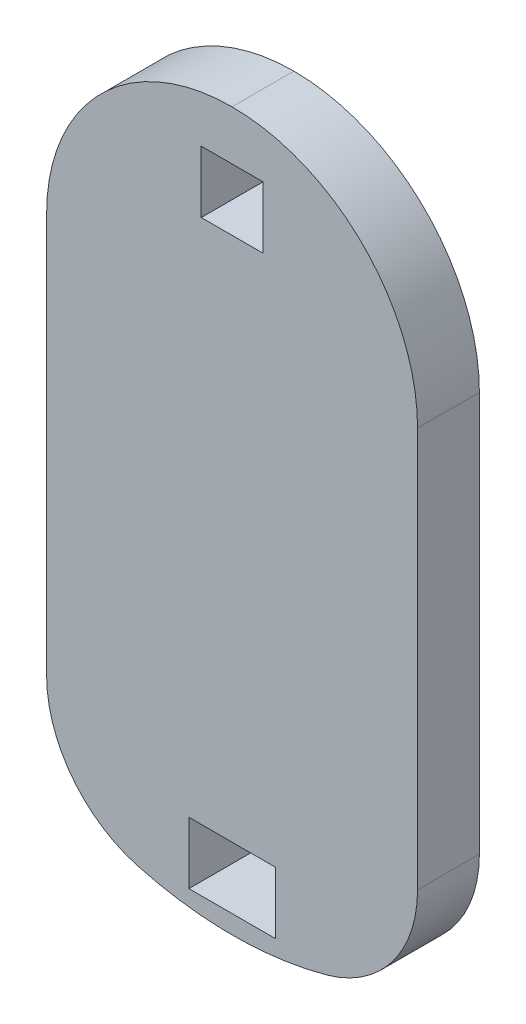
ISO-10303-21;
HEADER;
FILE_DESCRIPTION(('STEP AP214'),'2;1');
FILE_NAME('part.step','',(''),(''),'','','');
FILE_SCHEMA(('AUTOMOTIVE_DESIGN { 1 0 10303 214 1 1 1 1 }'));
ENDSEC;
DATA;
#1=APPLICATION_CONTEXT('core data for automotive mechanical design processes');
#2=APPLICATION_PROTOCOL_DEFINITION('international standard','automotive_design',2000,#1);
#3=PRODUCT_CONTEXT('',#1,'mechanical');
#4=PRODUCT('Part','Part','',(#3));
#5=PRODUCT_RELATED_PRODUCT_CATEGORY('part','',(#4));
#6=PRODUCT_DEFINITION_FORMATION('','',#4);
#7=PRODUCT_DEFINITION_CONTEXT('part definition',#1,'design');
#8=PRODUCT_DEFINITION('design','',#6,#7);
#9=PRODUCT_DEFINITION_SHAPE('','',#8);
#10=(LENGTH_UNIT() NAMED_UNIT(*) SI_UNIT(.MILLI.,.METRE.));
#11=(NAMED_UNIT(*) PLANE_ANGLE_UNIT() SI_UNIT($,.RADIAN.));
#12=(NAMED_UNIT(*) SI_UNIT($,.STERADIAN.) SOLID_ANGLE_UNIT());
#13=UNCERTAINTY_MEASURE_WITH_UNIT(LENGTH_MEASURE(1.E-05),#10,'distance_accuracy_value','');
#14=(GEOMETRIC_REPRESENTATION_CONTEXT(3) GLOBAL_UNCERTAINTY_ASSIGNED_CONTEXT((#13)) GLOBAL_UNIT_ASSIGNED_CONTEXT((#10,
#11,#12)) REPRESENTATION_CONTEXT('',''));
#15=CARTESIAN_POINT('',(0.,0.,0.));
#16=DIRECTION('',(0.,0.,1.));
#17=DIRECTION('',(1.,0.,0.));
#18=AXIS2_PLACEMENT_3D('',#15,#16,#17);
#19=CARTESIAN_POINT('',(0.,0.,5.));
#20=DIRECTION('',(0.,0.,-1.));
#21=DIRECTION('',(-1.,0.,0.));
#22=AXIS2_PLACEMENT_3D('',#19,#20,#21);
#23=CYLINDRICAL_SURFACE('',#22,29.);
#24=CARTESIAN_POINT('',(0.,0.,5.));
#25=DIRECTION('',(0.,0.,1.));
#26=DIRECTION('',(1.,0.,0.));
#27=AXIS2_PLACEMENT_3D('',#24,#25,#26);
#28=CIRCLE('',#27,29.);
#29=CARTESIAN_POINT('',(-7.63882553025275,-27.9758528827694,5.));
#30=VERTEX_POINT('',#29);
#31=CARTESIAN_POINT('',(7.62433236448409,-27.979806217983,5.));
#32=VERTEX_POINT('',#31);
#33=EDGE_CURVE('E199',#30,#32,#28,.T.);
#34=ORIENTED_EDGE('',*,*,#33,.F.);
#35=DIRECTION('',(0.,0.,-1.));
#36=VECTOR('',#35,1.);
#37=CARTESIAN_POINT('',(-7.63882553025275,-27.9758528827694,5.));
#38=LINE('',#37,#36);
#39=CARTESIAN_POINT('',(-7.63882553025275,-27.9758528827694,0.));
#40=VERTEX_POINT('',#39);
#41=EDGE_CURVE('E235',#30,#40,#38,.T.);
#42=ORIENTED_EDGE('',*,*,#41,.T.);
#43=CARTESIAN_POINT('',(0.,0.,0.));
#44=DIRECTION('',(0.,0.,1.));
#45=DIRECTION('',(1.,0.,0.));
#46=AXIS2_PLACEMENT_3D('',#43,#44,#45);
#47=CIRCLE('',#46,29.);
#48=CARTESIAN_POINT('',(7.62433236448409,-27.979806217983,0.));
#49=VERTEX_POINT('',#48);
#50=EDGE_CURVE('E195',#40,#49,#47,.T.);
#51=ORIENTED_EDGE('',*,*,#50,.T.);
#52=DIRECTION('',(0.,0.,-1.));
#53=VECTOR('',#52,1.);
#54=CARTESIAN_POINT('',(7.62433236448409,-27.979806217983,5.));
#55=LINE('',#54,#53);
#56=EDGE_CURVE('E232',#49,#32,#55,.F.);
#57=ORIENTED_EDGE('',*,*,#56,.T.);
#58=EDGE_LOOP('',(#34,#42,#51,#57));
#59=FACE_BOUND('',#58,.T.);
#60=ADVANCED_FACE('F34',(#59),#23,.T.);
#61=CARTESIAN_POINT('',(0.,0.,5.));
#62=DIRECTION('',(0.,0.,1.));
#63=DIRECTION('',(1.,0.,0.));
#64=AXIS2_PLACEMENT_3D('',#61,#62,#63);
#65=PLANE('',#64);
#66=DIRECTION('',(0.,-1.,0.));
#67=VECTOR('',#66,1.);
#68=CARTESIAN_POINT('',(-2.5,24.9999983324085,5.));
#69=LINE('',#68,#67);
#70=CARTESIAN_POINT('',(-2.5,24.9999983324085,5.));
#71=VERTEX_POINT('',#70);
#72=CARTESIAN_POINT('',(-2.5,19.9999983324085,5.));
#73=VERTEX_POINT('',#72);
#74=EDGE_CURVE('E49',#71,#73,#69,.T.);
#75=ORIENTED_EDGE('',*,*,#74,.F.);
#76=DIRECTION('',(-1.,0.,0.));
#77=VECTOR('',#76,1.);
#78=CARTESIAN_POINT('',(-2.5,24.9999983324085,5.));
#79=LINE('',#78,#77);
#80=CARTESIAN_POINT('',(2.5,24.9999983324085,5.));
#81=VERTEX_POINT('',#80);
#82=EDGE_CURVE('E165',#81,#71,#79,.T.);
#83=ORIENTED_EDGE('',*,*,#82,.F.);
#84=DIRECTION('',(0.,1.,0.));
#85=VECTOR('',#84,1.);
#86=CARTESIAN_POINT('',(2.5,24.9999983324085,5.));
#87=LINE('',#86,#85);
#88=CARTESIAN_POINT('',(2.5,19.9999983324085,5.));
#89=VERTEX_POINT('',#88);
#90=EDGE_CURVE('E148',#89,#81,#87,.T.);
#91=ORIENTED_EDGE('',*,*,#90,.F.);
#92=DIRECTION('',(1.,0.,0.));
#93=VECTOR('',#92,1.);
#94=CARTESIAN_POINT('',(-2.5,19.9999983324085,5.));
#95=LINE('',#94,#93);
#96=EDGE_CURVE('E158',#73,#89,#95,.T.);
#97=ORIENTED_EDGE('',*,*,#96,.F.);
#98=EDGE_LOOP('',(#75,#83,#91,#97));
#99=FACE_BOUND('',#98,.T.);
#100=DIRECTION('',(0.,-1.,0.));
#101=VECTOR('',#100,1.);
#102=CARTESIAN_POINT('',(-3.5,-22.5000016675915,5.));
#103=LINE('',#102,#101);
#104=CARTESIAN_POINT('',(-3.5,-22.5000016675915,5.));
#105=VERTEX_POINT('',#104);
#106=CARTESIAN_POINT('',(-3.5,-27.5000016675915,5.));
#107=VERTEX_POINT('',#106);
#108=EDGE_CURVE('E57',#105,#107,#103,.T.);
#109=ORIENTED_EDGE('',*,*,#108,.F.);
#110=DIRECTION('',(-1.,0.,0.));
#111=VECTOR('',#110,1.);
#112=CARTESIAN_POINT('',(-3.5,-22.5000016675915,5.));
#113=LINE('',#112,#111);
#114=CARTESIAN_POINT('',(3.5,-22.5000016675915,5.));
#115=VERTEX_POINT('',#114);
#116=EDGE_CURVE('E182',#115,#105,#113,.T.);
#117=ORIENTED_EDGE('',*,*,#116,.F.);
#118=DIRECTION('',(0.,1.,0.));
#119=VECTOR('',#118,1.);
#120=CARTESIAN_POINT('',(3.5,-22.5000016675915,5.));
#121=LINE('',#120,#119);
#122=CARTESIAN_POINT('',(3.5,-27.5000016675915,5.));
#123=VERTEX_POINT('',#122);
#124=EDGE_CURVE('E179',#123,#115,#121,.T.);
#125=ORIENTED_EDGE('',*,*,#124,.F.);
#126=DIRECTION('',(1.,0.,0.));
#127=VECTOR('',#126,1.);
#128=CARTESIAN_POINT('',(-3.5,-27.5000016675915,5.));
#129=LINE('',#128,#127);
#130=EDGE_CURVE('E176',#107,#123,#129,.T.);
#131=ORIENTED_EDGE('',*,*,#130,.F.);
#132=EDGE_LOOP('',(#109,#117,#125,#131));
#133=FACE_BOUND('',#132,.T.);
#134=DIRECTION('',(0.,1.,0.));
#135=VECTOR('',#134,1.);
#136=CARTESIAN_POINT('',(-15.0047477612001,24.8164772806851,5.));
#137=LINE('',#136,#135);
#138=CARTESIAN_POINT('',(-15.0047477612001,-18.3290070611248,5.));
#139=VERTEX_POINT('',#138);
#140=CARTESIAN_POINT('',(-15.0047477612001,13.9999991949558,5.));
#141=VERTEX_POINT('',#140);
#142=EDGE_CURVE('E193',#139,#141,#137,.T.);
#143=ORIENTED_EDGE('',*,*,#142,.F.);
#144=CARTESIAN_POINT('',(-5.00474776120008,-18.3290070611248,5.));
#145=DIRECTION('',(0.,0.,1.));
#146=DIRECTION('',(1.,0.,0.));
#147=AXIS2_PLACEMENT_3D('',#144,#145,#146);
#148=CIRCLE('',#147,10.);
#149=EDGE_CURVE('E230',#139,#30,#148,.T.);
#150=ORIENTED_EDGE('',*,*,#149,.T.);
#151=ORIENTED_EDGE('',*,*,#33,.T.);
#152=CARTESIAN_POINT('',(4.99525223879992,-18.3315971772992,5.));
#153=DIRECTION('',(0.,0.,1.));
#154=DIRECTION('',(1.,0.,0.));
#155=AXIS2_PLACEMENT_3D('',#152,#153,#154);
#156=CIRCLE('',#155,10.);
#157=CARTESIAN_POINT('',(14.9952522387999,-18.3315971772992,5.));
#158=VERTEX_POINT('',#157);
#159=EDGE_CURVE('E228',#32,#158,#156,.T.);
#160=ORIENTED_EDGE('',*,*,#159,.T.);
#161=DIRECTION('',(0.,-1.,0.));
#162=VECTOR('',#161,1.);
#163=CARTESIAN_POINT('',(14.9952522387999,24.8222160633326,5.));
#164=LINE('',#163,#162);
#165=CARTESIAN_POINT('',(14.9952522387999,13.9999991949558,5.));
#166=VERTEX_POINT('',#165);
#167=EDGE_CURVE('E196',#166,#158,#164,.T.);
#168=ORIENTED_EDGE('',*,*,#167,.F.);
#169=CARTESIAN_POINT('',(-0.00474776120007632,13.9999991949558,5.));
#170=DIRECTION('',(0.,0.,1.));
#171=DIRECTION('',(1.,0.,0.));
#172=AXIS2_PLACEMENT_3D('',#169,#170,#171);
#173=CIRCLE('',#172,15.);
#174=CARTESIAN_POINT('',(-0.00983464820015809,28.9999983324085,5.));
#175=VERTEX_POINT('',#174);
#176=EDGE_CURVE('E209',#166,#175,#173,.T.);
#177=ORIENTED_EDGE('',*,*,#176,.T.);
#178=CARTESIAN_POINT('',(-0.00474776120007805,13.9999991949558,5.));
#179=DIRECTION('',(0.,0.,1.));
#180=DIRECTION('',(1.,0.,0.));
#181=AXIS2_PLACEMENT_3D('',#178,#179,#180);
#182=CIRCLE('',#181,15.);
#183=EDGE_CURVE('E211',#175,#141,#182,.T.);
#184=ORIENTED_EDGE('',*,*,#183,.T.);
#185=EDGE_LOOP('',(#143,#150,#151,#160,#168,#177,#184));
#186=FACE_BOUND('',#185,.T.);
#187=ADVANCED_FACE('F162',(#99,#133,#186),#65,.T.);
#188=CARTESIAN_POINT('',(0.,0.,0.));
#189=DIRECTION('',(0.,0.,1.));
#190=DIRECTION('',(1.,0.,0.));
#191=AXIS2_PLACEMENT_3D('',#188,#189,#190);
#192=PLANE('',#191);
#193=DIRECTION('',(-1.,0.,0.));
#194=VECTOR('',#193,1.);
#195=CARTESIAN_POINT('',(0.,24.9999983324085,0.));
#196=LINE('',#195,#194);
#197=CARTESIAN_POINT('',(2.5,24.9999983324085,0.));
#198=VERTEX_POINT('',#197);
#199=CARTESIAN_POINT('',(-2.5,24.9999983324085,0.));
#200=VERTEX_POINT('',#199);
#201=EDGE_CURVE('E42',#198,#200,#196,.T.);
#202=ORIENTED_EDGE('',*,*,#201,.T.);
#203=DIRECTION('',(0.,-1.,0.));
#204=VECTOR('',#203,1.);
#205=CARTESIAN_POINT('',(-2.5,0.,0.));
#206=LINE('',#205,#204);
#207=CARTESIAN_POINT('',(-2.5,19.9999983324085,0.));
#208=VERTEX_POINT('',#207);
#209=EDGE_CURVE('E11',#200,#208,#206,.T.);
#210=ORIENTED_EDGE('',*,*,#209,.T.);
#211=DIRECTION('',(1.,0.,0.));
#212=VECTOR('',#211,1.);
#213=CARTESIAN_POINT('',(0.,19.9999983324085,0.));
#214=LINE('',#213,#212);
#215=CARTESIAN_POINT('',(2.5,19.9999983324085,0.));
#216=VERTEX_POINT('',#215);
#217=EDGE_CURVE('E255',#208,#216,#214,.T.);
#218=ORIENTED_EDGE('',*,*,#217,.T.);
#219=DIRECTION('',(0.,1.,0.));
#220=VECTOR('',#219,1.);
#221=CARTESIAN_POINT('',(2.5,0.,0.));
#222=LINE('',#221,#220);
#223=EDGE_CURVE('E151',#216,#198,#222,.T.);
#224=ORIENTED_EDGE('',*,*,#223,.T.);
#225=EDGE_LOOP('',(#202,#210,#218,#224));
#226=FACE_BOUND('',#225,.T.);
#227=DIRECTION('',(-1.,0.,0.));
#228=VECTOR('',#227,1.);
#229=CARTESIAN_POINT('',(0.,-22.5000016675915,0.));
#230=LINE('',#229,#228);
#231=CARTESIAN_POINT('',(3.5,-22.5000016675915,0.));
#232=VERTEX_POINT('',#231);
#233=CARTESIAN_POINT('',(-3.5,-22.5000016675915,0.));
#234=VERTEX_POINT('',#233);
#235=EDGE_CURVE('E249',#232,#234,#230,.T.);
#236=ORIENTED_EDGE('',*,*,#235,.T.);
#237=DIRECTION('',(0.,-1.,0.));
#238=VECTOR('',#237,1.);
#239=CARTESIAN_POINT('',(-3.5,0.,0.));
#240=LINE('',#239,#238);
#241=CARTESIAN_POINT('',(-3.5,-27.5000016675915,0.));
#242=VERTEX_POINT('',#241);
#243=EDGE_CURVE('E252',#234,#242,#240,.T.);
#244=ORIENTED_EDGE('',*,*,#243,.T.);
#245=DIRECTION('',(1.,0.,0.));
#246=VECTOR('',#245,1.);
#247=CARTESIAN_POINT('',(0.,-27.5000016675915,0.));
#248=LINE('',#247,#246);
#249=CARTESIAN_POINT('',(3.5,-27.5000016675915,0.));
#250=VERTEX_POINT('',#249);
#251=EDGE_CURVE('E243',#242,#250,#248,.T.);
#252=ORIENTED_EDGE('',*,*,#251,.T.);
#253=DIRECTION('',(0.,1.,0.));
#254=VECTOR('',#253,1.);
#255=CARTESIAN_POINT('',(3.5,0.,0.));
#256=LINE('',#255,#254);
#257=EDGE_CURVE('E246',#250,#232,#256,.T.);
#258=ORIENTED_EDGE('',*,*,#257,.T.);
#259=EDGE_LOOP('',(#236,#244,#252,#258));
#260=FACE_BOUND('',#259,.T.);
#261=ORIENTED_EDGE('',*,*,#50,.F.);
#262=CARTESIAN_POINT('',(-5.00474776120008,-18.3290070611248,0.));
#263=DIRECTION('',(0.,0.,1.));
#264=DIRECTION('',(1.,0.,0.));
#265=AXIS2_PLACEMENT_3D('',#262,#263,#264);
#266=CIRCLE('',#265,10.);
#267=CARTESIAN_POINT('',(-15.0047477612001,-18.3290070611248,0.));
#268=VERTEX_POINT('',#267);
#269=EDGE_CURVE('E239',#40,#268,#266,.F.);
#270=ORIENTED_EDGE('',*,*,#269,.T.);
#271=DIRECTION('',(0.,1.,0.));
#272=VECTOR('',#271,1.);
#273=CARTESIAN_POINT('',(-15.0047477612001,0.,0.));
#274=LINE('',#273,#272);
#275=CARTESIAN_POINT('',(-15.0047477612001,13.9999991949558,0.));
#276=VERTEX_POINT('',#275);
#277=EDGE_CURVE('E207',#268,#276,#274,.T.);
#278=ORIENTED_EDGE('',*,*,#277,.T.);
#279=CARTESIAN_POINT('',(-0.00474776120007805,13.9999991949558,0.));
#280=DIRECTION('',(0.,0.,1.));
#281=DIRECTION('',(1.,0.,0.));
#282=AXIS2_PLACEMENT_3D('',#279,#280,#281);
#283=CIRCLE('',#282,15.);
#284=CARTESIAN_POINT('',(-0.00983464820015809,28.9999983324085,0.));
#285=VERTEX_POINT('',#284);
#286=EDGE_CURVE('E219',#276,#285,#283,.F.);
#287=ORIENTED_EDGE('',*,*,#286,.T.);
#288=CARTESIAN_POINT('',(-0.00474776120007632,13.9999991949558,0.));
#289=DIRECTION('',(0.,0.,1.));
#290=DIRECTION('',(1.,0.,0.));
#291=AXIS2_PLACEMENT_3D('',#288,#289,#290);
#292=CIRCLE('',#291,15.);
#293=CARTESIAN_POINT('',(14.9952522387999,13.9999991949558,0.));
#294=VERTEX_POINT('',#293);
#295=EDGE_CURVE('E217',#285,#294,#292,.F.);
#296=ORIENTED_EDGE('',*,*,#295,.T.);
#297=DIRECTION('',(0.,-1.,0.));
#298=VECTOR('',#297,1.);
#299=CARTESIAN_POINT('',(14.9952522387999,0.,0.));
#300=LINE('',#299,#298);
#301=CARTESIAN_POINT('',(14.9952522387999,-18.3315971772992,0.));
#302=VERTEX_POINT('',#301);
#303=EDGE_CURVE('E202',#294,#302,#300,.T.);
#304=ORIENTED_EDGE('',*,*,#303,.T.);
#305=CARTESIAN_POINT('',(4.99525223879992,-18.3315971772992,0.));
#306=DIRECTION('',(0.,0.,1.));
#307=DIRECTION('',(1.,0.,0.));
#308=AXIS2_PLACEMENT_3D('',#305,#306,#307);
#309=CIRCLE('',#308,10.);
#310=EDGE_CURVE('E237',#302,#49,#309,.F.);
#311=ORIENTED_EDGE('',*,*,#310,.T.);
#312=EDGE_LOOP('',(#261,#270,#278,#287,#296,#304,#311));
#313=FACE_BOUND('',#312,.T.);
#314=ADVANCED_FACE('F259',(#226,#260,#313),#192,.F.);
#315=CARTESIAN_POINT('',(14.9952522387999,24.8222160633326,-5.));
#316=DIRECTION('',(-1.,0.,0.));
#317=DIRECTION('',(0.,0.,1.));
#318=AXIS2_PLACEMENT_3D('',#315,#316,#317);
#319=PLANE('',#318);
#320=ORIENTED_EDGE('',*,*,#167,.T.);
#321=DIRECTION('',(0.,0.,-1.));
#322=VECTOR('',#321,1.);
#323=CARTESIAN_POINT('',(14.9952522387999,-18.3315971772992,-5.));
#324=LINE('',#323,#322);
#325=EDGE_CURVE('E241',#158,#302,#324,.T.);
#326=ORIENTED_EDGE('',*,*,#325,.T.);
#327=ORIENTED_EDGE('',*,*,#303,.F.);
#328=DIRECTION('',(0.,0.,-1.));
#329=VECTOR('',#328,1.);
#330=CARTESIAN_POINT('',(14.9952522387999,13.9999991949558,-5.));
#331=LINE('',#330,#329);
#332=EDGE_CURVE('E221',#294,#166,#331,.F.);
#333=ORIENTED_EDGE('',*,*,#332,.T.);
#334=EDGE_LOOP('',(#320,#326,#327,#333));
#335=FACE_BOUND('',#334,.T.);
#336=ADVANCED_FACE('F322',(#335),#319,.F.);
#337=CARTESIAN_POINT('',(-15.0047477612001,24.8164772806851,-5.));
#338=DIRECTION('',(1.,0.,0.));
#339=DIRECTION('',(0.,0.,-1.));
#340=AXIS2_PLACEMENT_3D('',#337,#338,#339);
#341=PLANE('',#340);
#342=ORIENTED_EDGE('',*,*,#277,.F.);
#343=DIRECTION('',(0.,0.,-1.));
#344=VECTOR('',#343,1.);
#345=CARTESIAN_POINT('',(-15.0047477612001,-18.3290070611248,-5.));
#346=LINE('',#345,#344);
#347=EDGE_CURVE('E223',#268,#139,#346,.F.);
#348=ORIENTED_EDGE('',*,*,#347,.T.);
#349=ORIENTED_EDGE('',*,*,#142,.T.);
#350=DIRECTION('',(0.,0.,-1.));
#351=VECTOR('',#350,1.);
#352=CARTESIAN_POINT('',(-15.0047477612001,13.9999991949558,-5.));
#353=LINE('',#352,#351);
#354=EDGE_CURVE('E214',#141,#276,#353,.T.);
#355=ORIENTED_EDGE('',*,*,#354,.T.);
#356=EDGE_LOOP('',(#342,#348,#349,#355));
#357=FACE_BOUND('',#356,.T.);
#358=ADVANCED_FACE('F295',(#357),#341,.F.);
#359=CARTESIAN_POINT('',(-0.00474776120007632,13.9999991949558,5.));
#360=DIRECTION('',(0.,0.,-1.));
#361=DIRECTION('',(-1.,0.,0.));
#362=AXIS2_PLACEMENT_3D('',#359,#360,#361);
#363=CYLINDRICAL_SURFACE('',#362,15.);
#364=ORIENTED_EDGE('',*,*,#332,.F.);
#365=ORIENTED_EDGE('',*,*,#295,.F.);
#366=DIRECTION('',(0.,0.,-1.));
#367=VECTOR('',#366,1.);
#368=CARTESIAN_POINT('',(-0.00983464820015809,28.9999983324085,5.));
#369=LINE('',#368,#367);
#370=EDGE_CURVE('E172',#175,#285,#369,.T.);
#371=ORIENTED_EDGE('',*,*,#370,.F.);
#372=ORIENTED_EDGE('',*,*,#176,.F.);
#373=EDGE_LOOP('',(#364,#365,#371,#372));
#374=FACE_BOUND('',#373,.T.);
#375=ADVANCED_FACE('F292',(#374),#363,.T.);
#376=CARTESIAN_POINT('',(-0.00474776120007805,13.9999991949558,5.));
#377=DIRECTION('',(0.,0.,-1.));
#378=DIRECTION('',(-1.,0.,0.));
#379=AXIS2_PLACEMENT_3D('',#376,#377,#378);
#380=CYLINDRICAL_SURFACE('',#379,15.);
#381=ORIENTED_EDGE('',*,*,#286,.F.);
#382=ORIENTED_EDGE('',*,*,#354,.F.);
#383=ORIENTED_EDGE('',*,*,#183,.F.);
#384=ORIENTED_EDGE('',*,*,#370,.T.);
#385=EDGE_LOOP('',(#381,#382,#383,#384));
#386=FACE_BOUND('',#385,.T.);
#387=ADVANCED_FACE('F288',(#386),#380,.T.);
#388=CARTESIAN_POINT('',(-5.00474776120008,-18.3290070611248,5.));
#389=DIRECTION('',(0.,0.,-1.));
#390=DIRECTION('',(-1.,0.,0.));
#391=AXIS2_PLACEMENT_3D('',#388,#389,#390);
#392=CYLINDRICAL_SURFACE('',#391,10.);
#393=ORIENTED_EDGE('',*,*,#269,.F.);
#394=ORIENTED_EDGE('',*,*,#41,.F.);
#395=ORIENTED_EDGE('',*,*,#149,.F.);
#396=ORIENTED_EDGE('',*,*,#347,.F.);
#397=EDGE_LOOP('',(#393,#394,#395,#396));
#398=FACE_BOUND('',#397,.T.);
#399=ADVANCED_FACE('F291',(#398),#392,.T.);
#400=CARTESIAN_POINT('',(4.99525223879992,-18.3315971772992,5.));
#401=DIRECTION('',(0.,0.,-1.));
#402=DIRECTION('',(-1.,0.,0.));
#403=AXIS2_PLACEMENT_3D('',#400,#401,#402);
#404=CYLINDRICAL_SURFACE('',#403,10.);
#405=ORIENTED_EDGE('',*,*,#310,.F.);
#406=ORIENTED_EDGE('',*,*,#325,.F.);
#407=ORIENTED_EDGE('',*,*,#159,.F.);
#408=ORIENTED_EDGE('',*,*,#56,.F.);
#409=EDGE_LOOP('',(#405,#406,#407,#408));
#410=FACE_BOUND('',#409,.T.);
#411=ADVANCED_FACE('F36',(#410),#404,.T.);
#412=CARTESIAN_POINT('',(-3.5,-22.5000016675915,-5.));
#413=DIRECTION('',(-1.,0.,0.));
#414=DIRECTION('',(0.,-1.,0.));
#415=AXIS2_PLACEMENT_3D('',#412,#413,#414);
#416=PLANE('',#415);
#417=DIRECTION('',(0.,0.,1.));
#418=VECTOR('',#417,1.);
#419=CARTESIAN_POINT('',(-3.5,-22.5000016675915,-5.));
#420=LINE('',#419,#418);
#421=EDGE_CURVE('E186',#234,#105,#420,.T.);
#422=ORIENTED_EDGE('',*,*,#421,.T.);
#423=ORIENTED_EDGE('',*,*,#108,.T.);
#424=DIRECTION('',(0.,0.,1.));
#425=VECTOR('',#424,1.);
#426=CARTESIAN_POINT('',(-3.5,-27.5000016675915,-5.));
#427=LINE('',#426,#425);
#428=EDGE_CURVE('E185',#242,#107,#427,.T.);
#429=ORIENTED_EDGE('',*,*,#428,.F.);
#430=ORIENTED_EDGE('',*,*,#243,.F.);
#431=EDGE_LOOP('',(#422,#423,#429,#430));
#432=FACE_BOUND('',#431,.T.);
#433=ADVANCED_FACE('F302',(#432),#416,.F.);
#434=CARTESIAN_POINT('',(-3.5,-22.5000016675915,-5.));
#435=DIRECTION('',(0.,1.,0.));
#436=DIRECTION('',(0.,0.,1.));
#437=AXIS2_PLACEMENT_3D('',#434,#435,#436);
#438=PLANE('',#437);
#439=DIRECTION('',(0.,0.,1.));
#440=VECTOR('',#439,1.);
#441=CARTESIAN_POINT('',(3.5,-22.5000016675915,-5.));
#442=LINE('',#441,#440);
#443=EDGE_CURVE('E188',#232,#115,#442,.T.);
#444=ORIENTED_EDGE('',*,*,#443,.T.);
#445=ORIENTED_EDGE('',*,*,#116,.T.);
#446=ORIENTED_EDGE('',*,*,#421,.F.);
#447=ORIENTED_EDGE('',*,*,#235,.F.);
#448=EDGE_LOOP('',(#444,#445,#446,#447));
#449=FACE_BOUND('',#448,.T.);
#450=ADVANCED_FACE('F336',(#449),#438,.F.);
#451=CARTESIAN_POINT('',(3.5,-22.5000016675915,-5.));
#452=DIRECTION('',(1.,0.,0.));
#453=DIRECTION('',(0.,1.,0.));
#454=AXIS2_PLACEMENT_3D('',#451,#452,#453);
#455=PLANE('',#454);
#456=DIRECTION('',(0.,0.,1.));
#457=VECTOR('',#456,1.);
#458=CARTESIAN_POINT('',(3.5,-27.5000016675915,-5.));
#459=LINE('',#458,#457);
#460=EDGE_CURVE('E190',#250,#123,#459,.T.);
#461=ORIENTED_EDGE('',*,*,#460,.T.);
#462=ORIENTED_EDGE('',*,*,#124,.T.);
#463=ORIENTED_EDGE('',*,*,#443,.F.);
#464=ORIENTED_EDGE('',*,*,#257,.F.);
#465=EDGE_LOOP('',(#461,#462,#463,#464));
#466=FACE_BOUND('',#465,.T.);
#467=ADVANCED_FACE('F273',(#466),#455,.F.);
#468=CARTESIAN_POINT('',(-3.5,-27.5000016675915,-5.));
#469=DIRECTION('',(0.,-1.,0.));
#470=DIRECTION('',(0.,0.,-1.));
#471=AXIS2_PLACEMENT_3D('',#468,#469,#470);
#472=PLANE('',#471);
#473=ORIENTED_EDGE('',*,*,#428,.T.);
#474=ORIENTED_EDGE('',*,*,#130,.T.);
#475=ORIENTED_EDGE('',*,*,#460,.F.);
#476=ORIENTED_EDGE('',*,*,#251,.F.);
#477=EDGE_LOOP('',(#473,#474,#475,#476));
#478=FACE_BOUND('',#477,.T.);
#479=ADVANCED_FACE('F266',(#478),#472,.F.);
#480=CARTESIAN_POINT('',(-2.5,24.9999983324085,-5.));
#481=DIRECTION('',(-1.,0.,0.));
#482=DIRECTION('',(0.,-1.,0.));
#483=AXIS2_PLACEMENT_3D('',#480,#481,#482);
#484=PLANE('',#483);
#485=DIRECTION('',(0.,0.,1.));
#486=VECTOR('',#485,1.);
#487=CARTESIAN_POINT('',(-2.5,24.9999983324085,-5.));
#488=LINE('',#487,#486);
#489=EDGE_CURVE('E170',#200,#71,#488,.T.);
#490=ORIENTED_EDGE('',*,*,#489,.T.);
#491=ORIENTED_EDGE('',*,*,#74,.T.);
#492=DIRECTION('',(0.,0.,1.));
#493=VECTOR('',#492,1.);
#494=CARTESIAN_POINT('',(-2.5,19.9999983324085,-5.));
#495=LINE('',#494,#493);
#496=EDGE_CURVE('E155',#208,#73,#495,.T.);
#497=ORIENTED_EDGE('',*,*,#496,.F.);
#498=ORIENTED_EDGE('',*,*,#209,.F.);
#499=EDGE_LOOP('',(#490,#491,#497,#498));
#500=FACE_BOUND('',#499,.T.);
#501=ADVANCED_FACE('F264',(#500),#484,.F.);
#502=CARTESIAN_POINT('',(-2.5,24.9999983324085,-5.));
#503=DIRECTION('',(0.,1.,0.));
#504=DIRECTION('',(0.,0.,1.));
#505=AXIS2_PLACEMENT_3D('',#502,#503,#504);
#506=PLANE('',#505);
#507=DIRECTION('',(0.,0.,1.));
#508=VECTOR('',#507,1.);
#509=CARTESIAN_POINT('',(2.5,24.9999983324085,-5.));
#510=LINE('',#509,#508);
#511=EDGE_CURVE('E154',#198,#81,#510,.T.);
#512=ORIENTED_EDGE('',*,*,#511,.T.);
#513=ORIENTED_EDGE('',*,*,#82,.T.);
#514=ORIENTED_EDGE('',*,*,#489,.F.);
#515=ORIENTED_EDGE('',*,*,#201,.F.);
#516=EDGE_LOOP('',(#512,#513,#514,#515));
#517=FACE_BOUND('',#516,.T.);
#518=ADVANCED_FACE('F263',(#517),#506,.F.);
#519=CARTESIAN_POINT('',(2.5,24.9999983324085,-5.));
#520=DIRECTION('',(1.,0.,0.));
#521=DIRECTION('',(0.,1.,0.));
#522=AXIS2_PLACEMENT_3D('',#519,#520,#521);
#523=PLANE('',#522);
#524=DIRECTION('',(0.,0.,1.));
#525=VECTOR('',#524,1.);
#526=CARTESIAN_POINT('',(2.5,19.9999983324085,-5.));
#527=LINE('',#526,#525);
#528=EDGE_CURVE('E143',#216,#89,#527,.T.);
#529=ORIENTED_EDGE('',*,*,#528,.T.);
#530=ORIENTED_EDGE('',*,*,#90,.T.);
#531=ORIENTED_EDGE('',*,*,#511,.F.);
#532=ORIENTED_EDGE('',*,*,#223,.F.);
#533=EDGE_LOOP('',(#529,#530,#531,#532));
#534=FACE_BOUND('',#533,.T.);
#535=ADVANCED_FACE('F145',(#534),#523,.F.);
#536=CARTESIAN_POINT('',(-2.5,19.9999983324085,-5.));
#537=DIRECTION('',(0.,-1.,0.));
#538=DIRECTION('',(0.,0.,-1.));
#539=AXIS2_PLACEMENT_3D('',#536,#537,#538);
#540=PLANE('',#539);
#541=ORIENTED_EDGE('',*,*,#496,.T.);
#542=ORIENTED_EDGE('',*,*,#96,.T.);
#543=ORIENTED_EDGE('',*,*,#528,.F.);
#544=ORIENTED_EDGE('',*,*,#217,.F.);
#545=EDGE_LOOP('',(#541,#542,#543,#544));
#546=FACE_BOUND('',#545,.T.);
#547=ADVANCED_FACE('F159',(#546),#540,.F.);
#548=CLOSED_SHELL('',(#60,#187,#314,#336,#358,#375,#387,#399,#411,#433,#450,#467,#479,#501,#518,
#535,#547));
#549=MANIFOLD_SOLID_BREP('B2',#548);
#550=ADVANCED_BREP_SHAPE_REPRESENTATION('',(#18,#549),#14);
#551=SHAPE_DEFINITION_REPRESENTATION(#9,#550);
ENDSEC;
END-ISO-10303-21;
